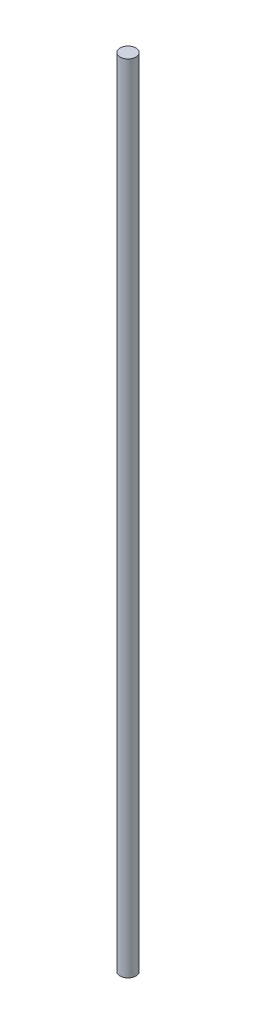
ISO-10303-21;
HEADER;
FILE_DESCRIPTION(('STEP AP214'),'2;1');
FILE_NAME('part.step','',(''),(''),'','','');
FILE_SCHEMA(('AUTOMOTIVE_DESIGN { 1 0 10303 214 1 1 1 1 }'));
ENDSEC;
DATA;
#1=APPLICATION_CONTEXT('core data for automotive mechanical design processes');
#2=APPLICATION_PROTOCOL_DEFINITION('international standard','automotive_design',2000,#1);
#3=PRODUCT_CONTEXT('',#1,'mechanical');
#4=PRODUCT('Part','Part','',(#3));
#5=PRODUCT_RELATED_PRODUCT_CATEGORY('part','',(#4));
#6=PRODUCT_DEFINITION_FORMATION('','',#4);
#7=PRODUCT_DEFINITION_CONTEXT('part definition',#1,'design');
#8=PRODUCT_DEFINITION('design','',#6,#7);
#9=PRODUCT_DEFINITION_SHAPE('','',#8);
#10=(LENGTH_UNIT() NAMED_UNIT(*) SI_UNIT(.MILLI.,.METRE.));
#11=(NAMED_UNIT(*) PLANE_ANGLE_UNIT() SI_UNIT($,.RADIAN.));
#12=(NAMED_UNIT(*) SI_UNIT($,.STERADIAN.) SOLID_ANGLE_UNIT());
#13=UNCERTAINTY_MEASURE_WITH_UNIT(LENGTH_MEASURE(1.E-05),#10,'distance_accuracy_value','');
#14=(GEOMETRIC_REPRESENTATION_CONTEXT(3) GLOBAL_UNCERTAINTY_ASSIGNED_CONTEXT((#13)) GLOBAL_UNIT_ASSIGNED_CONTEXT((#10,
#11,#12)) REPRESENTATION_CONTEXT('',''));
#15=CARTESIAN_POINT('',(0.,0.,0.));
#16=DIRECTION('',(0.,0.,1.));
#17=DIRECTION('',(1.,0.,0.));
#18=AXIS2_PLACEMENT_3D('',#15,#16,#17);
#19=CARTESIAN_POINT('',(0.,400.,0.));
#20=DIRECTION('',(0.,-1.,0.));
#21=DIRECTION('',(0.,0.,-1.));
#22=AXIS2_PLACEMENT_3D('',#19,#20,#21);
#23=CYLINDRICAL_SURFACE('',#22,4.);
#24=CARTESIAN_POINT('',(0.,400.,0.));
#25=DIRECTION('',(0.,1.,0.));
#26=DIRECTION('',(0.,0.,1.));
#27=AXIS2_PLACEMENT_3D('',#24,#25,#26);
#28=CIRCLE('',#27,4.);
#29=CARTESIAN_POINT('',(0.,400.,4.));
#30=VERTEX_POINT('',#29);
#31=EDGE_CURVE('E10',#30,#30,#28,.T.);
#32=ORIENTED_EDGE('',*,*,#31,.F.);
#33=EDGE_LOOP('',(#32));
#34=FACE_BOUND('',#33,.T.);
#35=CARTESIAN_POINT('',(0.,0.,0.));
#36=DIRECTION('',(0.,1.,0.));
#37=DIRECTION('',(0.,0.,1.));
#38=AXIS2_PLACEMENT_3D('',#35,#36,#37);
#39=CIRCLE('',#38,4.);
#40=CARTESIAN_POINT('',(0.,0.,4.));
#41=VERTEX_POINT('',#40);
#42=EDGE_CURVE('E36',#41,#41,#39,.T.);
#43=ORIENTED_EDGE('',*,*,#42,.T.);
#44=EDGE_LOOP('',(#43));
#45=FACE_BOUND('',#44,.T.);
#46=ADVANCED_FACE('F33',(#34,#45),#23,.T.);
#47=CARTESIAN_POINT('',(0.,400.,0.));
#48=DIRECTION('',(0.,1.,0.));
#49=DIRECTION('',(0.,0.,1.));
#50=AXIS2_PLACEMENT_3D('',#47,#48,#49);
#51=PLANE('',#50);
#52=ORIENTED_EDGE('',*,*,#31,.T.);
#53=EDGE_LOOP('',(#52));
#54=FACE_BOUND('',#53,.T.);
#55=ADVANCED_FACE('F48',(#54),#51,.T.);
#56=CARTESIAN_POINT('',(0.,0.,0.));
#57=DIRECTION('',(0.,1.,0.));
#58=DIRECTION('',(0.,0.,1.));
#59=AXIS2_PLACEMENT_3D('',#56,#57,#58);
#60=PLANE('',#59);
#61=ORIENTED_EDGE('',*,*,#42,.F.);
#62=EDGE_LOOP('',(#61));
#63=FACE_BOUND('',#62,.T.);
#64=ADVANCED_FACE('F46',(#63),#60,.F.);
#65=CLOSED_SHELL('',(#46,#55,#64));
#66=MANIFOLD_SOLID_BREP('B2',#65);
#67=ADVANCED_BREP_SHAPE_REPRESENTATION('',(#18,#66),#14);
#68=SHAPE_DEFINITION_REPRESENTATION(#9,#67);
ENDSEC;
END-ISO-10303-21;
